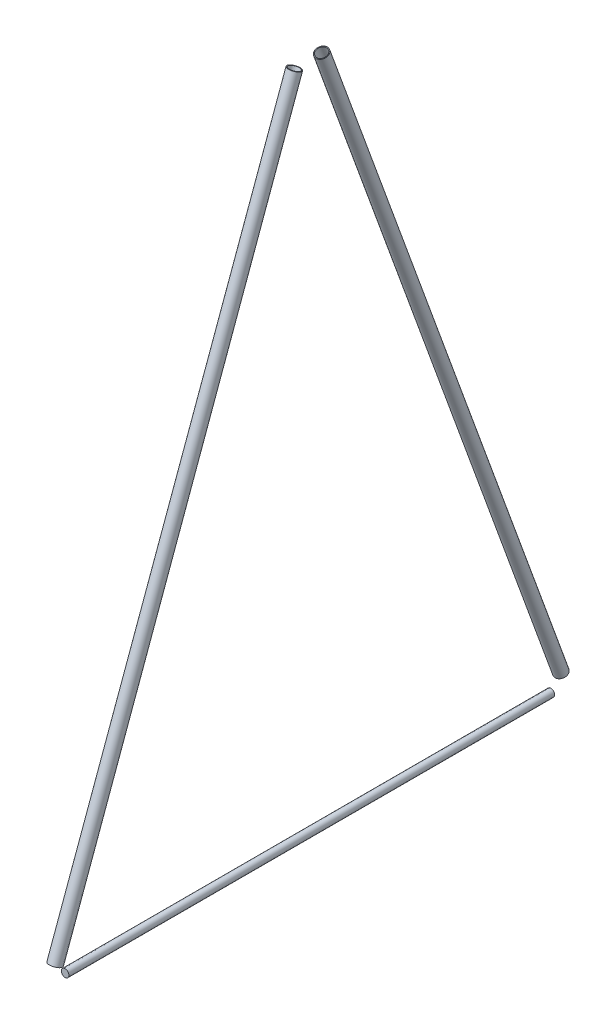
ISO-10303-21;
HEADER;
FILE_DESCRIPTION(('STEP AP214'),'2;1');
FILE_NAME('part.step','',(''),(''),'','','');
FILE_SCHEMA(('AUTOMOTIVE_DESIGN { 1 0 10303 214 1 1 1 1 }'));
ENDSEC;
DATA;
#1=APPLICATION_CONTEXT('core data for automotive mechanical design processes');
#2=APPLICATION_PROTOCOL_DEFINITION('international standard','automotive_design',2000,#1);
#3=PRODUCT_CONTEXT('',#1,'mechanical');
#4=PRODUCT('Part','Part','',(#3));
#5=PRODUCT_RELATED_PRODUCT_CATEGORY('part','',(#4));
#6=PRODUCT_DEFINITION_FORMATION('','',#4);
#7=PRODUCT_DEFINITION_CONTEXT('part definition',#1,'design');
#8=PRODUCT_DEFINITION('design','',#6,#7);
#9=PRODUCT_DEFINITION_SHAPE('','',#8);
#10=(LENGTH_UNIT() NAMED_UNIT(*) SI_UNIT(.MILLI.,.METRE.));
#11=(NAMED_UNIT(*) PLANE_ANGLE_UNIT() SI_UNIT($,.RADIAN.));
#12=(NAMED_UNIT(*) SI_UNIT($,.STERADIAN.) SOLID_ANGLE_UNIT());
#13=UNCERTAINTY_MEASURE_WITH_UNIT(LENGTH_MEASURE(1.E-05),#10,'distance_accuracy_value','');
#14=(GEOMETRIC_REPRESENTATION_CONTEXT(3) GLOBAL_UNCERTAINTY_ASSIGNED_CONTEXT((#13)) GLOBAL_UNIT_ASSIGNED_CONTEXT((#10,
#11,#12)) REPRESENTATION_CONTEXT('',''));
#15=CARTESIAN_POINT('',(0.,0.,0.));
#16=DIRECTION('',(0.,0.,1.));
#17=DIRECTION('',(1.,0.,0.));
#18=AXIS2_PLACEMENT_3D('',#15,#16,#17);
#19=CARTESIAN_POINT('',(0.,44.45,-508.));
#20=DIRECTION('',(0.,0.,1.));
#21=DIRECTION('',(1.,0.,0.));
#22=AXIS2_PLACEMENT_3D('',#19,#20,#21);
#23=CYLINDRICAL_SURFACE('',#22,7.9375);
#24=CARTESIAN_POINT('',(0.,44.45,-508.));
#25=DIRECTION('',(0.,0.,1.));
#26=DIRECTION('',(1.,0.,0.));
#27=AXIS2_PLACEMENT_3D('',#24,#25,#26);
#28=CIRCLE('',#27,7.9375);
#29=CARTESIAN_POINT('',(7.9375,44.45,-508.));
#30=VERTEX_POINT('',#29);
#31=EDGE_CURVE('E11',#30,#30,#28,.T.);
#32=ORIENTED_EDGE('',*,*,#31,.T.);
#33=EDGE_LOOP('',(#32));
#34=FACE_BOUND('',#33,.T.);
#35=CARTESIAN_POINT('',(0.,44.45,508.));
#36=DIRECTION('',(0.,0.,1.));
#37=DIRECTION('',(1.,0.,0.));
#38=AXIS2_PLACEMENT_3D('',#35,#36,#37);
#39=CIRCLE('',#38,7.9375);
#40=CARTESIAN_POINT('',(7.9375,44.45,508.));
#41=VERTEX_POINT('',#40);
#42=EDGE_CURVE('E51',#41,#41,#39,.T.);
#43=ORIENTED_EDGE('',*,*,#42,.F.);
#44=EDGE_LOOP('',(#43));
#45=FACE_BOUND('',#44,.T.);
#46=ADVANCED_FACE('F45',(#34,#45),#23,.T.);
#47=CARTESIAN_POINT('',(0.,44.45,-508.));
#48=DIRECTION('',(0.,0.,1.));
#49=DIRECTION('',(1.,0.,0.));
#50=AXIS2_PLACEMENT_3D('',#47,#48,#49);
#51=PLANE('',#50);
#52=ORIENTED_EDGE('',*,*,#31,.F.);
#53=EDGE_LOOP('',(#52));
#54=FACE_BOUND('',#53,.T.);
#55=ADVANCED_FACE('F60',(#54),#51,.F.);
#56=CARTESIAN_POINT('',(0.,44.45,508.));
#57=DIRECTION('',(0.,0.,1.));
#58=DIRECTION('',(1.,0.,0.));
#59=AXIS2_PLACEMENT_3D('',#56,#57,#58);
#60=PLANE('',#59);
#61=ORIENTED_EDGE('',*,*,#42,.T.);
#62=EDGE_LOOP('',(#61));
#63=FACE_BOUND('',#62,.T.);
#64=ADVANCED_FACE('F57',(#63),#60,.T.);
#65=CLOSED_SHELL('',(#46,#55,#64));
#66=MANIFOLD_SOLID_BREP('B2',#65);
#67=CARTESIAN_POINT('',(0.,1443.24848070219,28.5750000000004));
#68=DIRECTION('',(0.,-0.939496842805007,0.34255756065138));
#69=DIRECTION('',(0.,-0.34255756065138,-0.939496842805007));
#70=AXIS2_PLACEMENT_3D('',#67,#68,#69);
#71=CYLINDRICAL_SURFACE('',#70,12.7);
#72=CARTESIAN_POINT('',(0.,1443.24848070219,28.5750000000004));
#73=DIRECTION('',(0.,-0.939496842805007,0.34255756065138));
#74=DIRECTION('',(0.,-0.34255756065138,-0.939496842805007));
#75=AXIS2_PLACEMENT_3D('',#72,#73,#74);
#76=CIRCLE('',#75,12.7);
#77=CARTESIAN_POINT('',(0.,1438.89799968192,16.6433900963768));
#78=VERTEX_POINT('',#77);
#79=EDGE_CURVE('E44',#78,#78,#76,.T.);
#80=ORIENTED_EDGE('',*,*,#79,.T.);
#81=EDGE_LOOP('',(#80));
#82=FACE_BOUND('',#81,.T.);
#83=CARTESIAN_POINT('',(0.,71.1133417854769,528.880317331341));
#84=DIRECTION('',(0.,-0.939496842805007,0.34255756065138));
#85=DIRECTION('',(0.,-0.34255756065138,-0.939496842805007));
#86=AXIS2_PLACEMENT_3D('',#83,#84,#85);
#87=CIRCLE('',#86,12.7);
#88=CARTESIAN_POINT('',(0.,66.7628607652044,516.948707427718));
#89=VERTEX_POINT('',#88);
#90=EDGE_CURVE('E102',#89,#89,#87,.T.);
#91=ORIENTED_EDGE('',*,*,#90,.F.);
#92=EDGE_LOOP('',(#91));
#93=FACE_BOUND('',#92,.T.);
#94=ADVANCED_FACE('F92',(#82,#93),#71,.T.);
#95=CARTESIAN_POINT('',(0.,1443.24848070219,28.5750000000004));
#96=DIRECTION('',(0.,-0.939496842805007,0.34255756065138));
#97=DIRECTION('',(0.,-0.34255756065138,-0.939496842805007));
#98=AXIS2_PLACEMENT_3D('',#95,#96,#97);
#99=PLANE('',#98);
#100=CARTESIAN_POINT('',(0.,1443.24848070219,28.5750000000004));
#101=DIRECTION('',(0.,-0.939496842805007,0.34255756065138));
#102=DIRECTION('',(0.,-0.34255756065138,-0.939496842805007));
#103=AXIS2_PLACEMENT_3D('',#100,#101,#102);
#104=CIRCLE('',#103,11.049);
#105=CARTESIAN_POINT('',(0.,1439.46356221455,18.1944993838478));
#106=VERTEX_POINT('',#105);
#107=EDGE_CURVE('E98',#106,#106,#104,.T.);
#108=ORIENTED_EDGE('',*,*,#107,.T.);
#109=EDGE_LOOP('',(#108));
#110=FACE_BOUND('',#109,.T.);
#111=ORIENTED_EDGE('',*,*,#79,.F.);
#112=EDGE_LOOP('',(#111));
#113=FACE_BOUND('',#112,.T.);
#114=ADVANCED_FACE('F121',(#110,#113),#99,.F.);
#115=CARTESIAN_POINT('',(0.,1443.24848070219,28.5750000000004));
#116=DIRECTION('',(0.,-0.939496842805007,0.34255756065138));
#117=DIRECTION('',(0.,-0.34255756065138,-0.939496842805007));
#118=AXIS2_PLACEMENT_3D('',#115,#116,#117);
#119=CYLINDRICAL_SURFACE('',#118,11.049);
#120=ORIENTED_EDGE('',*,*,#107,.F.);
#121=EDGE_LOOP('',(#120));
#122=FACE_BOUND('',#121,.T.);
#123=CARTESIAN_POINT('',(0.,71.1133417854769,528.880317331341));
#124=DIRECTION('',(0.,-0.939496842805007,0.34255756065138));
#125=DIRECTION('',(0.,-0.34255756065138,-0.939496842805007));
#126=AXIS2_PLACEMENT_3D('',#123,#124,#125);
#127=CIRCLE('',#126,11.049);
#128=CARTESIAN_POINT('',(0.,67.3284232978398,518.499816715189));
#129=VERTEX_POINT('',#128);
#130=EDGE_CURVE('E106',#129,#129,#127,.T.);
#131=ORIENTED_EDGE('',*,*,#130,.T.);
#132=EDGE_LOOP('',(#131));
#133=FACE_BOUND('',#132,.T.);
#134=ADVANCED_FACE('F112',(#122,#133),#119,.F.);
#135=CARTESIAN_POINT('',(0.,71.1133417854769,528.880317331341));
#136=DIRECTION('',(0.,-0.939496842805007,0.34255756065138));
#137=DIRECTION('',(0.,-0.34255756065138,-0.939496842805007));
#138=AXIS2_PLACEMENT_3D('',#135,#136,#137);
#139=PLANE('',#138);
#140=ORIENTED_EDGE('',*,*,#90,.T.);
#141=EDGE_LOOP('',(#140));
#142=FACE_BOUND('',#141,.T.);
#143=ORIENTED_EDGE('',*,*,#130,.F.);
#144=EDGE_LOOP('',(#143));
#145=FACE_BOUND('',#144,.T.);
#146=ADVANCED_FACE('F114',(#142,#145),#139,.T.);
#147=CLOSED_SHELL('',(#94,#114,#134,#146));
#148=MANIFOLD_SOLID_BREP('B6',#147);
#149=CARTESIAN_POINT('',(0.,71.1133417854769,-528.880317331341));
#150=DIRECTION('',(0.,0.939496842805007,0.34255756065138));
#151=DIRECTION('',(0.,-0.34255756065138,0.939496842805007));
#152=AXIS2_PLACEMENT_3D('',#149,#150,#151);
#153=CYLINDRICAL_SURFACE('',#152,12.7);
#154=CARTESIAN_POINT('',(0.,71.1133417854769,-528.880317331341));
#155=DIRECTION('',(0.,0.939496842805007,0.34255756065138));
#156=DIRECTION('',(0.,-0.34255756065138,0.939496842805007));
#157=AXIS2_PLACEMENT_3D('',#154,#155,#156);
#158=CIRCLE('',#157,12.7);
#159=CARTESIAN_POINT('',(0.,66.7628607652044,-516.948707427717));
#160=VERTEX_POINT('',#159);
#161=EDGE_CURVE('E91',#160,#160,#158,.T.);
#162=ORIENTED_EDGE('',*,*,#161,.T.);
#163=EDGE_LOOP('',(#162));
#164=FACE_BOUND('',#163,.T.);
#165=CARTESIAN_POINT('',(0.,1443.24848070219,-28.575));
#166=DIRECTION('',(0.,0.939496842805007,0.34255756065138));
#167=DIRECTION('',(0.,-0.34255756065138,0.939496842805007));
#168=AXIS2_PLACEMENT_3D('',#165,#166,#167);
#169=CIRCLE('',#168,12.7);
#170=CARTESIAN_POINT('',(0.,1438.89799968192,-16.6433900963764));
#171=VERTEX_POINT('',#170);
#172=EDGE_CURVE('E163',#171,#171,#169,.T.);
#173=ORIENTED_EDGE('',*,*,#172,.F.);
#174=EDGE_LOOP('',(#173));
#175=FACE_BOUND('',#174,.T.);
#176=ADVANCED_FACE('F153',(#164,#175),#153,.T.);
#177=CARTESIAN_POINT('',(0.,71.1133417854769,-528.880317331341));
#178=DIRECTION('',(0.,0.939496842805007,0.34255756065138));
#179=DIRECTION('',(0.,-0.34255756065138,0.939496842805007));
#180=AXIS2_PLACEMENT_3D('',#177,#178,#179);
#181=PLANE('',#180);
#182=CARTESIAN_POINT('',(0.,71.1133417854769,-528.880317331341));
#183=DIRECTION('',(0.,0.939496842805007,0.34255756065138));
#184=DIRECTION('',(0.,-0.34255756065138,0.939496842805007));
#185=AXIS2_PLACEMENT_3D('',#182,#183,#184);
#186=CIRCLE('',#185,11.049);
#187=CARTESIAN_POINT('',(0.,67.3284232978398,-518.499816715189));
#188=VERTEX_POINT('',#187);
#189=EDGE_CURVE('E159',#188,#188,#186,.T.);
#190=ORIENTED_EDGE('',*,*,#189,.T.);
#191=EDGE_LOOP('',(#190));
#192=FACE_BOUND('',#191,.T.);
#193=ORIENTED_EDGE('',*,*,#161,.F.);
#194=EDGE_LOOP('',(#193));
#195=FACE_BOUND('',#194,.T.);
#196=ADVANCED_FACE('F182',(#192,#195),#181,.F.);
#197=CARTESIAN_POINT('',(0.,71.1133417854769,-528.880317331341));
#198=DIRECTION('',(0.,0.939496842805007,0.34255756065138));
#199=DIRECTION('',(0.,-0.34255756065138,0.939496842805007));
#200=AXIS2_PLACEMENT_3D('',#197,#198,#199);
#201=CYLINDRICAL_SURFACE('',#200,11.049);
#202=ORIENTED_EDGE('',*,*,#189,.F.);
#203=EDGE_LOOP('',(#202));
#204=FACE_BOUND('',#203,.T.);
#205=CARTESIAN_POINT('',(0.,1443.24848070219,-28.575));
#206=DIRECTION('',(0.,0.939496842805007,0.34255756065138));
#207=DIRECTION('',(0.,-0.34255756065138,0.939496842805007));
#208=AXIS2_PLACEMENT_3D('',#205,#206,#207);
#209=CIRCLE('',#208,11.049);
#210=CARTESIAN_POINT('',(0.,1439.46356221455,-18.1944993838474));
#211=VERTEX_POINT('',#210);
#212=EDGE_CURVE('E167',#211,#211,#209,.T.);
#213=ORIENTED_EDGE('',*,*,#212,.T.);
#214=EDGE_LOOP('',(#213));
#215=FACE_BOUND('',#214,.T.);
#216=ADVANCED_FACE('F173',(#204,#215),#201,.F.);
#217=CARTESIAN_POINT('',(0.,1443.24848070219,-28.575));
#218=DIRECTION('',(0.,0.939496842805007,0.34255756065138));
#219=DIRECTION('',(0.,-0.34255756065138,0.939496842805007));
#220=AXIS2_PLACEMENT_3D('',#217,#218,#219);
#221=PLANE('',#220);
#222=ORIENTED_EDGE('',*,*,#172,.T.);
#223=EDGE_LOOP('',(#222));
#224=FACE_BOUND('',#223,.T.);
#225=ORIENTED_EDGE('',*,*,#212,.F.);
#226=EDGE_LOOP('',(#225));
#227=FACE_BOUND('',#226,.T.);
#228=ADVANCED_FACE('F175',(#224,#227),#221,.T.);
#229=CLOSED_SHELL('',(#176,#196,#216,#228));
#230=MANIFOLD_SOLID_BREP('B39',#229);
#231=ADVANCED_BREP_SHAPE_REPRESENTATION('',(#18,#66,#148,#230),#14);
#232=SHAPE_DEFINITION_REPRESENTATION(#9,#231);
ENDSEC;
END-ISO-10303-21;
